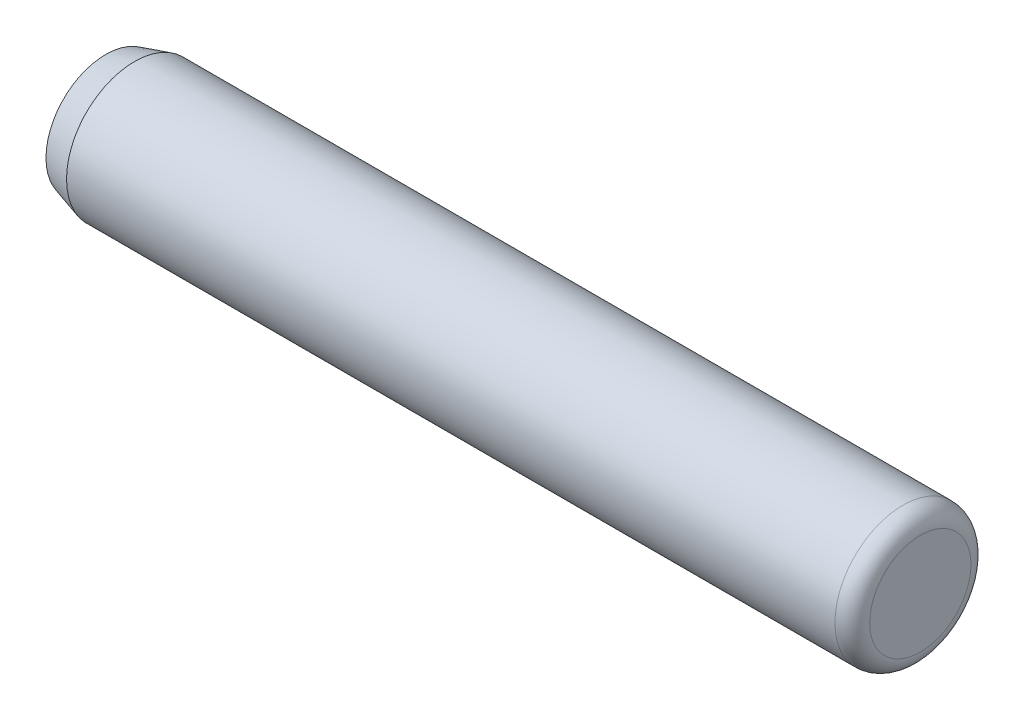
ISO-10303-21;
HEADER;
FILE_DESCRIPTION(('STEP AP214'),'2;1');
FILE_NAME('part.step','',(''),(''),'','','');
FILE_SCHEMA(('AUTOMOTIVE_DESIGN { 1 0 10303 214 1 1 1 1 }'));
ENDSEC;
DATA;
#1=APPLICATION_CONTEXT('core data for automotive mechanical design processes');
#2=APPLICATION_PROTOCOL_DEFINITION('international standard','automotive_design',2000,#1);
#3=PRODUCT_CONTEXT('',#1,'mechanical');
#4=PRODUCT('Part','Part','',(#3));
#5=PRODUCT_RELATED_PRODUCT_CATEGORY('part','',(#4));
#6=PRODUCT_DEFINITION_FORMATION('','',#4);
#7=PRODUCT_DEFINITION_CONTEXT('part definition',#1,'design');
#8=PRODUCT_DEFINITION('design','',#6,#7);
#9=PRODUCT_DEFINITION_SHAPE('','',#8);
#10=(LENGTH_UNIT() NAMED_UNIT(*) SI_UNIT(.MILLI.,.METRE.));
#11=(NAMED_UNIT(*) PLANE_ANGLE_UNIT() SI_UNIT($,.RADIAN.));
#12=(NAMED_UNIT(*) SI_UNIT($,.STERADIAN.) SOLID_ANGLE_UNIT());
#13=UNCERTAINTY_MEASURE_WITH_UNIT(LENGTH_MEASURE(1.E-05),#10,'distance_accuracy_value','');
#14=(GEOMETRIC_REPRESENTATION_CONTEXT(3) GLOBAL_UNCERTAINTY_ASSIGNED_CONTEXT((#13)) GLOBAL_UNIT_ASSIGNED_CONTEXT((#10,
#11,#12)) REPRESENTATION_CONTEXT('',''));
#15=CARTESIAN_POINT('',(0.,0.,0.));
#16=DIRECTION('',(0.,0.,1.));
#17=DIRECTION('',(1.,0.,0.));
#18=AXIS2_PLACEMENT_3D('',#15,#16,#17);
#19=CARTESIAN_POINT('',(9.1186,0.,0.));
#20=DIRECTION('',(-1.,0.,0.));
#21=DIRECTION('',(0.,0.,1.));
#22=AXIS2_PLACEMENT_3D('',#19,#20,#21);
#23=TOROIDAL_SURFACE('',#22,1.18364,0.406400000000001);
#24=CARTESIAN_POINT('',(9.1186,0.,0.));
#25=DIRECTION('',(-1.,0.,0.));
#26=DIRECTION('',(0.,0.,1.));
#27=AXIS2_PLACEMENT_3D('',#24,#25,#26);
#28=CIRCLE('',#27,1.59004);
#29=CARTESIAN_POINT('',(9.1186,0.,1.59004));
#30=VERTEX_POINT('',#29);
#31=EDGE_CURVE('E10',#30,#30,#28,.T.);
#32=ORIENTED_EDGE('',*,*,#31,.F.);
#33=EDGE_LOOP('',(#32));
#34=FACE_BOUND('',#33,.T.);
#35=CARTESIAN_POINT('',(9.525,0.,0.));
#36=DIRECTION('',(-1.,0.,0.));
#37=DIRECTION('',(0.,0.,1.));
#38=AXIS2_PLACEMENT_3D('',#35,#36,#37);
#39=CIRCLE('',#38,1.18364);
#40=CARTESIAN_POINT('',(9.525,0.,1.18364));
#41=VERTEX_POINT('',#40);
#42=EDGE_CURVE('E59',#41,#41,#39,.T.);
#43=ORIENTED_EDGE('',*,*,#42,.T.);
#44=EDGE_LOOP('',(#43));
#45=FACE_BOUND('',#44,.T.);
#46=ADVANCED_FACE('F41',(#34,#45),#23,.T.);
#47=CARTESIAN_POINT('',(-9.525,0.,0.));
#48=DIRECTION('',(-1.,0.,0.));
#49=DIRECTION('',(0.,0.,1.));
#50=AXIS2_PLACEMENT_3D('',#47,#48,#49);
#51=CYLINDRICAL_SURFACE('',#50,1.59004);
#52=CARTESIAN_POINT('',(-8.85178951576095,0.,0.));
#53=DIRECTION('',(-1.,0.,0.));
#54=DIRECTION('',(0.,0.,1.));
#55=AXIS2_PLACEMENT_3D('',#52,#53,#54);
#56=CIRCLE('',#55,1.59004);
#57=CARTESIAN_POINT('',(-8.85178951576095,0.,1.59004));
#58=VERTEX_POINT('',#57);
#59=EDGE_CURVE('E48',#58,#58,#56,.T.);
#60=ORIENTED_EDGE('',*,*,#59,.F.);
#61=EDGE_LOOP('',(#60));
#62=FACE_BOUND('',#61,.T.);
#63=ORIENTED_EDGE('',*,*,#31,.T.);
#64=EDGE_LOOP('',(#63));
#65=FACE_BOUND('',#64,.T.);
#66=ADVANCED_FACE('F77',(#62,#65),#51,.T.);
#67=CARTESIAN_POINT('',(-8.85178951576095,0.,0.));
#68=DIRECTION('',(1.,0.,0.));
#69=DIRECTION('',(0.,0.,-1.));
#70=AXIS2_PLACEMENT_3D('',#67,#68,#69);
#71=CONICAL_SURFACE('',#70,1.59004,0.279252680319094);
#72=CARTESIAN_POINT('',(-9.525,0.,0.));
#73=DIRECTION('',(-1.,0.,0.));
#74=DIRECTION('',(0.,0.,1.));
#75=AXIS2_PLACEMENT_3D('',#72,#73,#74);
#76=CIRCLE('',#75,1.397);
#77=CARTESIAN_POINT('',(-9.525,0.,1.397));
#78=VERTEX_POINT('',#77);
#79=EDGE_CURVE('E54',#78,#78,#76,.T.);
#80=ORIENTED_EDGE('',*,*,#79,.F.);
#81=EDGE_LOOP('',(#80));
#82=FACE_BOUND('',#81,.T.);
#83=ORIENTED_EDGE('',*,*,#59,.T.);
#84=EDGE_LOOP('',(#83));
#85=FACE_BOUND('',#84,.T.);
#86=ADVANCED_FACE('F73',(#82,#85),#71,.T.);
#87=CARTESIAN_POINT('',(-9.525,1.397,0.));
#88=DIRECTION('',(1.,0.,0.));
#89=DIRECTION('',(0.,0.,-1.));
#90=AXIS2_PLACEMENT_3D('',#87,#88,#89);
#91=PLANE('',#90);
#92=ORIENTED_EDGE('',*,*,#79,.T.);
#93=EDGE_LOOP('',(#92));
#94=FACE_BOUND('',#93,.T.);
#95=ADVANCED_FACE('F68',(#94),#91,.F.);
#96=CARTESIAN_POINT('',(9.525,1.18364,0.));
#97=DIRECTION('',(-1.,0.,0.));
#98=DIRECTION('',(0.,0.,1.));
#99=AXIS2_PLACEMENT_3D('',#96,#97,#98);
#100=PLANE('',#99);
#101=ORIENTED_EDGE('',*,*,#42,.F.);
#102=EDGE_LOOP('',(#101));
#103=FACE_BOUND('',#102,.T.);
#104=ADVANCED_FACE('F66',(#103),#100,.F.);
#105=CLOSED_SHELL('',(#46,#66,#86,#95,#104));
#106=MANIFOLD_SOLID_BREP('B2',#105);
#107=ADVANCED_BREP_SHAPE_REPRESENTATION('',(#18,#106),#14);
#108=SHAPE_DEFINITION_REPRESENTATION(#9,#107);
ENDSEC;
END-ISO-10303-21;
